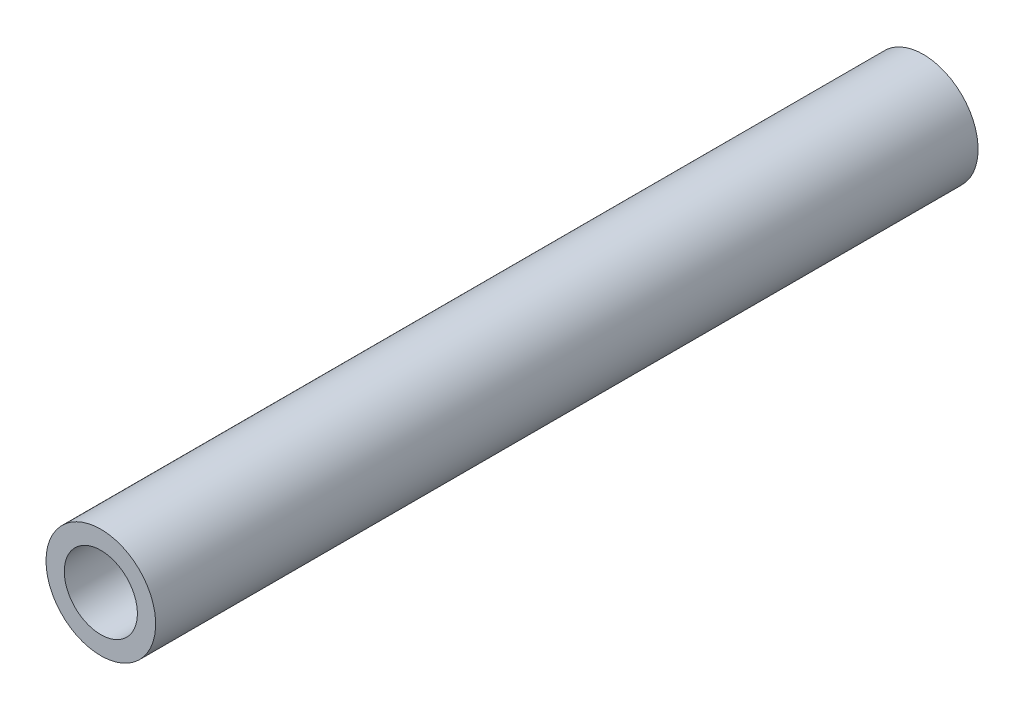
ISO-10303-21;
HEADER;
FILE_DESCRIPTION(('STEP AP214'),'2;1');
FILE_NAME('part.step','',(''),(''),'','','');
FILE_SCHEMA(('AUTOMOTIVE_DESIGN { 1 0 10303 214 1 1 1 1 }'));
ENDSEC;
DATA;
#1=APPLICATION_CONTEXT('core data for automotive mechanical design processes');
#2=APPLICATION_PROTOCOL_DEFINITION('international standard','automotive_design',2000,#1);
#3=PRODUCT_CONTEXT('',#1,'mechanical');
#4=PRODUCT('Part','Part','',(#3));
#5=PRODUCT_RELATED_PRODUCT_CATEGORY('part','',(#4));
#6=PRODUCT_DEFINITION_FORMATION('','',#4);
#7=PRODUCT_DEFINITION_CONTEXT('part definition',#1,'design');
#8=PRODUCT_DEFINITION('design','',#6,#7);
#9=PRODUCT_DEFINITION_SHAPE('','',#8);
#10=(LENGTH_UNIT() NAMED_UNIT(*) SI_UNIT(.MILLI.,.METRE.));
#11=(NAMED_UNIT(*) PLANE_ANGLE_UNIT() SI_UNIT($,.RADIAN.));
#12=(NAMED_UNIT(*) SI_UNIT($,.STERADIAN.) SOLID_ANGLE_UNIT());
#13=UNCERTAINTY_MEASURE_WITH_UNIT(LENGTH_MEASURE(1.E-05),#10,'distance_accuracy_value','');
#14=(GEOMETRIC_REPRESENTATION_CONTEXT(3) GLOBAL_UNCERTAINTY_ASSIGNED_CONTEXT((#13)) GLOBAL_UNIT_ASSIGNED_CONTEXT((#10,
#11,#12)) REPRESENTATION_CONTEXT('',''));
#15=CARTESIAN_POINT('',(0.,0.,0.));
#16=DIRECTION('',(0.,0.,1.));
#17=DIRECTION('',(1.,0.,0.));
#18=AXIS2_PLACEMENT_3D('',#15,#16,#17);
#19=CARTESIAN_POINT('',(70.,-82.5,53.4852813742386));
#20=DIRECTION('',(0.,0.,-1.));
#21=DIRECTION('',(-1.,0.,0.));
#22=AXIS2_PLACEMENT_3D('',#19,#20,#21);
#23=CYLINDRICAL_SURFACE('',#22,3.00000000000001);
#24=CARTESIAN_POINT('',(70.,-82.5,0.));
#25=DIRECTION('',(0.,0.,1.));
#26=DIRECTION('',(1.,0.,0.));
#27=AXIS2_PLACEMENT_3D('',#24,#25,#26);
#28=CIRCLE('',#27,3.00000000000001);
#29=CARTESIAN_POINT('',(67.,-82.5,0.));
#30=VERTEX_POINT('',#29);
#31=EDGE_CURVE('E46',#30,#30,#28,.T.);
#32=CARTESIAN_POINT('',(70.,-82.5,45.));
#33=DIRECTION('',(0.,0.,1.));
#34=DIRECTION('',(1.,0.,0.));
#35=AXIS2_PLACEMENT_3D('',#32,#33,#34);
#36=CIRCLE('',#35,3.00000000000001);
#37=CARTESIAN_POINT('',(67.,-82.5,45.));
#38=VERTEX_POINT('',#37);
#39=EDGE_CURVE('E10',#38,#38,#36,.T.);
#40=CARTESIAN_POINT('',(67.,-82.5,0.));
#41=CARTESIAN_POINT('',(67.,-82.5,0.468749999999993));
#42=CARTESIAN_POINT('',(67.,-82.5,0.937499999999992));
#43=CARTESIAN_POINT('',(67.,-82.5,1.87499999999999));
#44=CARTESIAN_POINT('',(67.,-82.5,2.34374999999999));
#45=CARTESIAN_POINT('',(67.,-82.5,3.28124999999999));
#46=CARTESIAN_POINT('',(67.,-82.5,3.74999999999999));
#47=CARTESIAN_POINT('',(67.,-82.5,4.68749999999999));
#48=CARTESIAN_POINT('',(67.,-82.5,5.15624999999999));
#49=CARTESIAN_POINT('',(67.,-82.5,6.09374999999999));
#50=CARTESIAN_POINT('',(67.,-82.5,6.56249999999999));
#51=CARTESIAN_POINT('',(67.,-82.5,7.5));
#52=CARTESIAN_POINT('',(67.,-82.5,7.96874999999999));
#53=CARTESIAN_POINT('',(67.,-82.5,8.90624999999999));
#54=CARTESIAN_POINT('',(67.,-82.5,9.37499999999999));
#55=CARTESIAN_POINT('',(67.,-82.5,10.3125));
#56=CARTESIAN_POINT('',(67.,-82.5,10.78125));
#57=CARTESIAN_POINT('',(67.,-82.5,11.71875));
#58=CARTESIAN_POINT('',(67.,-82.5,12.1875));
#59=CARTESIAN_POINT('',(67.,-82.5,13.125));
#60=CARTESIAN_POINT('',(67.,-82.5,13.59375));
#61=CARTESIAN_POINT('',(67.,-82.5,14.53125));
#62=CARTESIAN_POINT('',(67.,-82.5,15.));
#63=CARTESIAN_POINT('',(67.,-82.5,15.9375));
#64=CARTESIAN_POINT('',(67.,-82.5,16.40625));
#65=CARTESIAN_POINT('',(67.,-82.5,17.34375));
#66=CARTESIAN_POINT('',(67.,-82.5,17.8125));
#67=CARTESIAN_POINT('',(67.,-82.5,18.75));
#68=CARTESIAN_POINT('',(67.,-82.5,19.21875));
#69=CARTESIAN_POINT('',(67.,-82.5,20.15625));
#70=CARTESIAN_POINT('',(67.,-82.5,20.625));
#71=CARTESIAN_POINT('',(67.,-82.5,21.5625));
#72=CARTESIAN_POINT('',(67.,-82.5,22.03125));
#73=CARTESIAN_POINT('',(67.,-82.5,22.96875));
#74=CARTESIAN_POINT('',(67.,-82.5,23.4375));
#75=CARTESIAN_POINT('',(67.,-82.5,24.375));
#76=CARTESIAN_POINT('',(67.,-82.5,24.84375));
#77=CARTESIAN_POINT('',(67.,-82.5,25.78125));
#78=CARTESIAN_POINT('',(67.,-82.5,26.25));
#79=CARTESIAN_POINT('',(67.,-82.5,27.1875));
#80=CARTESIAN_POINT('',(67.,-82.5,27.65625));
#81=CARTESIAN_POINT('',(67.,-82.5,28.59375));
#82=CARTESIAN_POINT('',(67.,-82.5,29.0625));
#83=CARTESIAN_POINT('',(67.,-82.5,30.));
#84=CARTESIAN_POINT('',(67.,-82.5,30.46875));
#85=CARTESIAN_POINT('',(67.,-82.5,31.40625));
#86=CARTESIAN_POINT('',(67.,-82.5,31.875));
#87=CARTESIAN_POINT('',(67.,-82.5,32.8125));
#88=CARTESIAN_POINT('',(67.,-82.5,33.28125));
#89=CARTESIAN_POINT('',(67.,-82.5,34.21875));
#90=CARTESIAN_POINT('',(67.,-82.5,34.6875));
#91=CARTESIAN_POINT('',(67.,-82.5,35.625));
#92=CARTESIAN_POINT('',(67.,-82.5,36.09375));
#93=CARTESIAN_POINT('',(67.,-82.5,37.03125));
#94=CARTESIAN_POINT('',(67.,-82.5,37.5));
#95=CARTESIAN_POINT('',(67.,-82.5,38.4375));
#96=CARTESIAN_POINT('',(67.,-82.5,38.90625));
#97=CARTESIAN_POINT('',(67.,-82.5,39.84375));
#98=CARTESIAN_POINT('',(67.,-82.5,40.3125));
#99=CARTESIAN_POINT('',(67.,-82.5,41.25));
#100=CARTESIAN_POINT('',(67.,-82.5,41.71875));
#101=CARTESIAN_POINT('',(67.,-82.5,42.65625));
#102=CARTESIAN_POINT('',(67.,-82.5,43.125));
#103=CARTESIAN_POINT('',(67.,-82.5,44.0625));
#104=CARTESIAN_POINT('',(67.,-82.5,44.53125));
#105=CARTESIAN_POINT('',(67.,-82.5,45.));
#106=B_SPLINE_CURVE_WITH_KNOTS('',3,(#40,#41,#42,#43,#44,#45,#46,#47,#48,#49,#50,#51,#52,#53,
#54,#55,#56,#57,#58,#59,#60,#61,#62,#63,#64,#65,#66,#67,#68,#69,#70,#71,#72,#73,#74,#75,#76,#77,
#78,#79,#80,#81,#82,#83,#84,#85,#86,#87,#88,#89,#90,#91,#92,#93,#94,#95,#96,#97,#98,#99,#100,
#101,#102,#103,#104,#105),.UNSPECIFIED.,.F.,.F.,(4,2,2,2,2,2,2,2,2,2,2,2,2,2,2,2,2,2,2,2,2,2,2,
2,2,2,2,2,2,2,2,2,4),(0.,1.40625,2.8125,4.21875,5.625,7.03125,8.4375,9.84375,11.25,12.65625,
14.0625,15.46875,16.875,18.28125,19.6875,21.09375,22.5,23.90625,25.3125,26.71875,28.125,
29.53125,30.9375,32.34375,33.75,35.15625,36.5625,37.96875,39.375,40.78125,42.1875,43.59375,45.),.UNSPECIFIED.);
#107=EDGE_CURVE('BSEAM35',#30,#38,#106,.T.);
#108=ORIENTED_EDGE('',*,*,#31,.T.);
#109=ORIENTED_EDGE('',*,*,#39,.F.);
#110=ORIENTED_EDGE('',*,*,#107,.T.);
#111=ORIENTED_EDGE('',*,*,#107,.F.);
#112=EDGE_LOOP('',(#108,#110,#109,#111));
#113=FACE_BOUND('',#112,.T.);
#114=ADVANCED_FACE('F35',(#113),#23,.T.);
#115=CARTESIAN_POINT('',(70.,-82.5,0.));
#116=DIRECTION('',(0.,0.,1.));
#117=DIRECTION('',(1.,0.,0.));
#118=AXIS2_PLACEMENT_3D('',#115,#116,#117);
#119=PLANE('',#118);
#120=ORIENTED_EDGE('',*,*,#31,.F.);
#121=EDGE_LOOP('',(#120));
#122=FACE_BOUND('',#121,.T.);
#123=CARTESIAN_POINT('',(70.,-82.5,0.));
#124=DIRECTION('',(0.,0.,1.));
#125=DIRECTION('',(1.,0.,0.));
#126=AXIS2_PLACEMENT_3D('',#123,#124,#125);
#127=CIRCLE('',#126,2.);
#128=CARTESIAN_POINT('',(68.,-82.5,0.));
#129=VERTEX_POINT('',#128);
#130=EDGE_CURVE('E48',#129,#129,#127,.T.);
#131=ORIENTED_EDGE('',*,*,#130,.T.);
#132=EDGE_LOOP('',(#131));
#133=FACE_BOUND('',#132,.T.);
#134=ADVANCED_FACE('F57',(#122,#133),#119,.F.);
#135=CARTESIAN_POINT('',(70.,-82.5,53.4852813742386));
#136=DIRECTION('',(0.,0.,-1.));
#137=DIRECTION('',(-1.,0.,0.));
#138=AXIS2_PLACEMENT_3D('',#135,#136,#137);
#139=CYLINDRICAL_SURFACE('',#138,2.);
#140=CARTESIAN_POINT('',(70.,-82.5,45.));
#141=DIRECTION('',(0.,0.,1.));
#142=DIRECTION('',(1.,0.,0.));
#143=AXIS2_PLACEMENT_3D('',#140,#141,#142);
#144=CIRCLE('',#143,2.);
#145=CARTESIAN_POINT('',(68.,-82.5,45.));
#146=VERTEX_POINT('',#145);
#147=EDGE_CURVE('E38',#146,#146,#144,.T.);
#148=CARTESIAN_POINT('',(68.,-82.5,0.));
#149=CARTESIAN_POINT('',(68.,-82.5,0.468749999999993));
#150=CARTESIAN_POINT('',(68.,-82.5,0.937499999999992));
#151=CARTESIAN_POINT('',(68.,-82.5,1.87499999999999));
#152=CARTESIAN_POINT('',(68.,-82.5,2.34374999999999));
#153=CARTESIAN_POINT('',(68.,-82.5,3.28124999999999));
#154=CARTESIAN_POINT('',(68.,-82.5,3.74999999999999));
#155=CARTESIAN_POINT('',(68.,-82.5,4.68749999999999));
#156=CARTESIAN_POINT('',(68.,-82.5,5.15624999999999));
#157=CARTESIAN_POINT('',(68.,-82.5,6.09374999999999));
#158=CARTESIAN_POINT('',(68.,-82.5,6.56249999999999));
#159=CARTESIAN_POINT('',(68.,-82.5,7.5));
#160=CARTESIAN_POINT('',(68.,-82.5,7.96874999999999));
#161=CARTESIAN_POINT('',(68.,-82.5,8.90624999999999));
#162=CARTESIAN_POINT('',(68.,-82.5,9.37499999999999));
#163=CARTESIAN_POINT('',(68.,-82.5,10.3125));
#164=CARTESIAN_POINT('',(68.,-82.5,10.78125));
#165=CARTESIAN_POINT('',(68.,-82.5,11.71875));
#166=CARTESIAN_POINT('',(68.,-82.5,12.1875));
#167=CARTESIAN_POINT('',(68.,-82.5,13.125));
#168=CARTESIAN_POINT('',(68.,-82.5,13.59375));
#169=CARTESIAN_POINT('',(68.,-82.5,14.53125));
#170=CARTESIAN_POINT('',(68.,-82.5,15.));
#171=CARTESIAN_POINT('',(68.,-82.5,15.9375));
#172=CARTESIAN_POINT('',(68.,-82.5,16.40625));
#173=CARTESIAN_POINT('',(68.,-82.5,17.34375));
#174=CARTESIAN_POINT('',(68.,-82.5,17.8125));
#175=CARTESIAN_POINT('',(68.,-82.5,18.75));
#176=CARTESIAN_POINT('',(68.,-82.5,19.21875));
#177=CARTESIAN_POINT('',(68.,-82.5,20.15625));
#178=CARTESIAN_POINT('',(68.,-82.5,20.625));
#179=CARTESIAN_POINT('',(68.,-82.5,21.5625));
#180=CARTESIAN_POINT('',(68.,-82.5,22.03125));
#181=CARTESIAN_POINT('',(68.,-82.5,22.96875));
#182=CARTESIAN_POINT('',(68.,-82.5,23.4375));
#183=CARTESIAN_POINT('',(68.,-82.5,24.375));
#184=CARTESIAN_POINT('',(68.,-82.5,24.84375));
#185=CARTESIAN_POINT('',(68.,-82.5,25.78125));
#186=CARTESIAN_POINT('',(68.,-82.5,26.25));
#187=CARTESIAN_POINT('',(68.,-82.5,27.1875));
#188=CARTESIAN_POINT('',(68.,-82.5,27.65625));
#189=CARTESIAN_POINT('',(68.,-82.5,28.59375));
#190=CARTESIAN_POINT('',(68.,-82.5,29.0625));
#191=CARTESIAN_POINT('',(68.,-82.5,30.));
#192=CARTESIAN_POINT('',(68.,-82.5,30.46875));
#193=CARTESIAN_POINT('',(68.,-82.5,31.40625));
#194=CARTESIAN_POINT('',(68.,-82.5,31.875));
#195=CARTESIAN_POINT('',(68.,-82.5,32.8125));
#196=CARTESIAN_POINT('',(68.,-82.5,33.28125));
#197=CARTESIAN_POINT('',(68.,-82.5,34.21875));
#198=CARTESIAN_POINT('',(68.,-82.5,34.6875));
#199=CARTESIAN_POINT('',(68.,-82.5,35.625));
#200=CARTESIAN_POINT('',(68.,-82.5,36.09375));
#201=CARTESIAN_POINT('',(68.,-82.5,37.03125));
#202=CARTESIAN_POINT('',(68.,-82.5,37.5));
#203=CARTESIAN_POINT('',(68.,-82.5,38.4375));
#204=CARTESIAN_POINT('',(68.,-82.5,38.90625));
#205=CARTESIAN_POINT('',(68.,-82.5,39.84375));
#206=CARTESIAN_POINT('',(68.,-82.5,40.3125));
#207=CARTESIAN_POINT('',(68.,-82.5,41.25));
#208=CARTESIAN_POINT('',(68.,-82.5,41.71875));
#209=CARTESIAN_POINT('',(68.,-82.5,42.65625));
#210=CARTESIAN_POINT('',(68.,-82.5,43.125));
#211=CARTESIAN_POINT('',(68.,-82.5,44.0625));
#212=CARTESIAN_POINT('',(68.,-82.5,44.53125));
#213=CARTESIAN_POINT('',(68.,-82.5,45.));
#214=B_SPLINE_CURVE_WITH_KNOTS('',3,(#148,#149,#150,#151,#152,#153,#154,#155,#156,#157,#158,
#159,#160,#161,#162,#163,#164,#165,#166,#167,#168,#169,#170,#171,#172,#173,#174,#175,#176,#177,
#178,#179,#180,#181,#182,#183,#184,#185,#186,#187,#188,#189,#190,#191,#192,#193,#194,#195,#196,
#197,#198,#199,#200,#201,#202,#203,#204,#205,#206,#207,#208,#209,#210,#211,#212,#213),
.UNSPECIFIED.,.F.,.F.,(4,2,2,2,2,2,2,2,2,2,2,2,2,2,2,2,2,2,2,2,2,2,2,2,2,2,2,2,2,2,2,2,4),(0.,
1.40625,2.8125,4.21875,5.625,7.03125,8.4375,9.84375,11.25,12.65625,14.0625,15.46875,16.875,
18.28125,19.6875,21.09375,22.5,23.90625,25.3125,26.71875,28.125,29.53125,30.9375,32.34375,33.75,
35.15625,36.5625,37.96875,39.375,40.78125,42.1875,43.59375,45.),.UNSPECIFIED.);
#215=EDGE_CURVE('BSEAM60',#129,#146,#214,.T.);
#216=ORIENTED_EDGE('',*,*,#130,.F.);
#217=ORIENTED_EDGE('',*,*,#147,.T.);
#218=ORIENTED_EDGE('',*,*,#215,.T.);
#219=ORIENTED_EDGE('',*,*,#215,.F.);
#220=EDGE_LOOP('',(#216,#218,#217,#219));
#221=FACE_BOUND('',#220,.T.);
#222=ADVANCED_FACE('F60',(#221),#139,.F.);
#223=CARTESIAN_POINT('',(0.,0.,45.));
#224=DIRECTION('',(0.,0.,1.));
#225=DIRECTION('',(0.,-1.,0.));
#226=AXIS2_PLACEMENT_3D('',#223,#224,#225);
#227=PLANE('',#226);
#228=ORIENTED_EDGE('',*,*,#147,.F.);
#229=EDGE_LOOP('',(#228));
#230=FACE_BOUND('',#229,.T.);
#231=ORIENTED_EDGE('',*,*,#39,.T.);
#232=EDGE_LOOP('',(#231));
#233=FACE_BOUND('',#232,.T.);
#234=ADVANCED_FACE('F65',(#230,#233),#227,.T.);
#235=CLOSED_SHELL('',(#114,#134,#222,#234));
#236=MANIFOLD_SOLID_BREP('B2',#235);
#237=ADVANCED_BREP_SHAPE_REPRESENTATION('',(#18,#236),#14);
#238=SHAPE_DEFINITION_REPRESENTATION(#9,#237);
ENDSEC;
END-ISO-10303-21;
